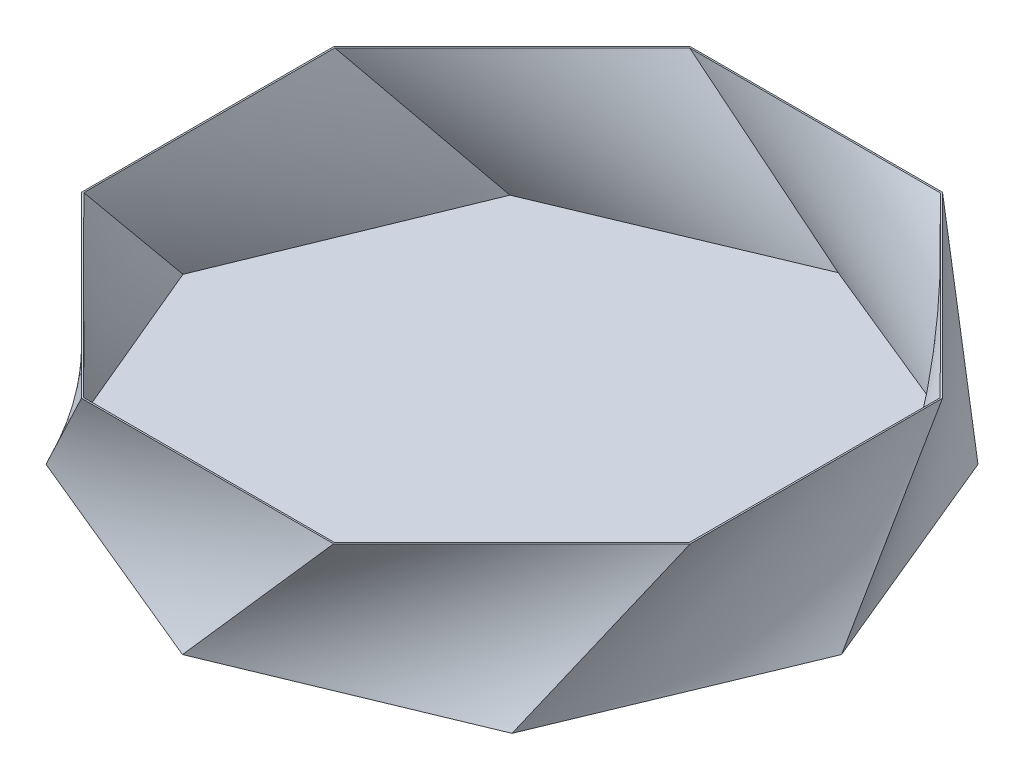
ISO-10303-21;
HEADER;
FILE_DESCRIPTION(('STEP AP214'),'2;1');
FILE_NAME('part.step','',(''),(''),'','','');
FILE_SCHEMA(('AUTOMOTIVE_DESIGN { 1 0 10303 214 1 1 1 1 }'));
ENDSEC;
DATA;
#1=APPLICATION_CONTEXT('core data for automotive mechanical design processes');
#2=APPLICATION_PROTOCOL_DEFINITION('international standard','automotive_design',2000,#1);
#3=PRODUCT_CONTEXT('',#1,'mechanical');
#4=PRODUCT('Part','Part','',(#3));
#5=PRODUCT_RELATED_PRODUCT_CATEGORY('part','',(#4));
#6=PRODUCT_DEFINITION_FORMATION('','',#4);
#7=PRODUCT_DEFINITION_CONTEXT('part definition',#1,'design');
#8=PRODUCT_DEFINITION('design','',#6,#7);
#9=PRODUCT_DEFINITION_SHAPE('','',#8);
#10=(LENGTH_UNIT() NAMED_UNIT(*) SI_UNIT(.MILLI.,.METRE.));
#11=(NAMED_UNIT(*) PLANE_ANGLE_UNIT() SI_UNIT($,.RADIAN.));
#12=(NAMED_UNIT(*) SI_UNIT($,.STERADIAN.) SOLID_ANGLE_UNIT());
#13=UNCERTAINTY_MEASURE_WITH_UNIT(LENGTH_MEASURE(1.E-05),#10,'distance_accuracy_value','');
#14=(GEOMETRIC_REPRESENTATION_CONTEXT(3) GLOBAL_UNCERTAINTY_ASSIGNED_CONTEXT((#13)) GLOBAL_UNIT_ASSIGNED_CONTEXT((#10,
#11,#12)) REPRESENTATION_CONTEXT('',''));
#15=CARTESIAN_POINT('',(0.,0.,0.));
#16=DIRECTION('',(0.,0.,1.));
#17=DIRECTION('',(1.,0.,0.));
#18=AXIS2_PLACEMENT_3D('',#15,#16,#17);
#19=CARTESIAN_POINT('',(-20.836063350552,10.1,-8.5373819747297));
#20=CARTESIAN_POINT('',(-20.787289481504,10.,-8.61037722821453));
#21=CARTESIAN_POINT('',(-15.9099025766973,0.,-15.9099025766973));
#22=CARTESIAN_POINT('',(-8.69648100049667,10.1,-20.770162376319));
#23=CARTESIAN_POINT('',(-8.61037722821452,10.,-20.787289481504));
#24=CARTESIAN_POINT('',(0.,0.,-22.5));
#25=B_SPLINE_SURFACE_WITH_KNOTS('',1,1,((#19,#20,#21),(#22,#23,#24)),.UNSPECIFIED.,.F.,.F.,.F.,
(2,2),(2,1,2),(0.,1.),(-0.01,0.,1.),.UNSPECIFIED.);
#26=DIRECTION('',(0.707106781186548,0.,-0.707106781186547));
#27=VECTOR('',#26,1.);
#28=CARTESIAN_POINT('',(-14.6988333548592,10.,-14.6988333548592));
#29=LINE('',#28,#27);
#30=CARTESIAN_POINT('',(-20.787289481504,10.,-8.61037722821452));
#31=VERTEX_POINT('',#30);
#32=CARTESIAN_POINT('',(-8.61037722821452,10.,-20.787289481504));
#33=VERTEX_POINT('',#32);
#34=EDGE_CURVE('E12',#31,#33,#29,.T.);
#35=DIRECTION('',(0.647064040189841,-0.751493254058066,-0.128709040080406));
#36=VECTOR('',#35,1.);
#37=CARTESIAN_POINT('',(-4.30518861410726,5.,-21.643644740752));
#38=LINE('',#37,#36);
#39=CARTESIAN_POINT('',(0.,0.,-22.5));
#40=VERTEX_POINT('',#39);
#41=EDGE_CURVE('E146',#33,#40,#38,.T.);
#42=DIRECTION('',(0.923879532511287,0.,-0.38268343236509));
#43=VECTOR('',#42,1.);
#44=CARTESIAN_POINT('',(-7.95495128834866,0.,-19.2049512883487));
#45=LINE('',#44,#43);
#46=CARTESIAN_POINT('',(-15.9099025766973,0.,-15.9099025766973));
#47=VERTEX_POINT('',#46);
#48=EDGE_CURVE('E585',#47,#40,#45,.T.);
#49=DIRECTION('',(0.366532335639335,-0.751493254058066,-0.548554405721067));
#50=VECTOR('',#49,1.);
#51=CARTESIAN_POINT('',(-18.3485960291006,5.,-12.2601399024559));
#52=LINE('',#51,#50);
#53=EDGE_CURVE('E541',#31,#47,#52,.T.);
#54=ORIENTED_EDGE('',*,*,#34,.T.);
#55=ORIENTED_EDGE('',*,*,#41,.T.);
#56=ORIENTED_EDGE('',*,*,#48,.F.);
#57=ORIENTED_EDGE('',*,*,#53,.F.);
#58=EDGE_LOOP('',(#54,#55,#56,#57));
#59=FACE_BOUND('',#58,.T.);
#60=ADVANCED_FACE('F137',(#59),#25,.T.);
#61=CARTESIAN_POINT('',(-8.69648100049667,10.1,-20.770162376319));
#62=CARTESIAN_POINT('',(-8.61037722821452,10.,-20.787289481504));
#63=CARTESIAN_POINT('',(0.,0.,-22.5));
#64=CARTESIAN_POINT('',(8.53738197472969,10.1,-20.836063350552));
#65=CARTESIAN_POINT('',(8.61037722821452,10.,-20.787289481504));
#66=CARTESIAN_POINT('',(15.9099025766973,0.,-15.9099025766973));
#67=B_SPLINE_SURFACE_WITH_KNOTS('',1,1,((#61,#62,#63),(#64,#65,#66)),.UNSPECIFIED.,.F.,.F.,.F.,
(2,2),(2,1,2),(0.,1.),(-0.01,0.,1.),.UNSPECIFIED.);
#68=DIRECTION('',(1.,0.,0.));
#69=VECTOR('',#68,1.);
#70=CARTESIAN_POINT('',(0.,10.,-20.787289481504));
#71=LINE('',#70,#69);
#72=CARTESIAN_POINT('',(8.61037722821452,10.,-20.787289481504));
#73=VERTEX_POINT('',#72);
#74=EDGE_CURVE('E163',#33,#73,#71,.T.);
#75=DIRECTION('',(0.548554405721067,-0.751493254058066,0.366532335639334));
#76=VECTOR('',#75,1.);
#77=CARTESIAN_POINT('',(12.2601399024559,5.,-18.3485960291006));
#78=LINE('',#77,#76);
#79=CARTESIAN_POINT('',(15.9099025766973,0.,-15.9099025766973));
#80=VERTEX_POINT('',#79);
#81=EDGE_CURVE('E547',#73,#80,#78,.T.);
#82=DIRECTION('',(0.923879532511287,0.,0.38268343236509));
#83=VECTOR('',#82,1.);
#84=CARTESIAN_POINT('',(7.95495128834866,0.,-19.2049512883487));
#85=LINE('',#84,#83);
#86=EDGE_CURVE('E545',#40,#80,#85,.T.);
#87=ORIENTED_EDGE('',*,*,#74,.T.);
#88=ORIENTED_EDGE('',*,*,#81,.T.);
#89=ORIENTED_EDGE('',*,*,#86,.F.);
#90=ORIENTED_EDGE('',*,*,#41,.F.);
#91=EDGE_LOOP('',(#87,#88,#89,#90));
#92=FACE_BOUND('',#91,.T.);
#93=ADVANCED_FACE('F309',(#92),#67,.T.);
#94=CARTESIAN_POINT('',(8.53738197472969,10.1,-20.836063350552));
#95=CARTESIAN_POINT('',(8.61037722821452,10.,-20.787289481504));
#96=CARTESIAN_POINT('',(15.9099025766973,0.,-15.9099025766973));
#97=CARTESIAN_POINT('',(20.770162376319,10.1,-8.69648100049667));
#98=CARTESIAN_POINT('',(20.787289481504,10.,-8.61037722821452));
#99=CARTESIAN_POINT('',(22.5,0.,0.));
#100=B_SPLINE_SURFACE_WITH_KNOTS('',1,1,((#94,#95,#96),(#97,#98,#99)),.UNSPECIFIED.,.F.,.F.,.F.,
(2,2),(2,1,2),(0.,1.),(-0.01,0.,1.),.UNSPECIFIED.);
#101=DIRECTION('',(0.707106781186547,0.,0.707106781186548));
#102=VECTOR('',#101,1.);
#103=CARTESIAN_POINT('',(14.6988333548592,10.,-14.6988333548592));
#104=LINE('',#103,#102);
#105=CARTESIAN_POINT('',(20.787289481504,10.,-8.61037722821452));
#106=VERTEX_POINT('',#105);
#107=EDGE_CURVE('E551',#73,#106,#104,.T.);
#108=DIRECTION('',(0.128709040080407,-0.751493254058066,0.64706404018984));
#109=VECTOR('',#108,1.);
#110=CARTESIAN_POINT('',(21.643644740752,5.,-4.30518861410726));
#111=LINE('',#110,#109);
#112=CARTESIAN_POINT('',(22.5,0.,0.));
#113=VERTEX_POINT('',#112);
#114=EDGE_CURVE('E554',#106,#113,#111,.T.);
#115=DIRECTION('',(0.38268343236509,0.,0.923879532511287));
#116=VECTOR('',#115,1.);
#117=CARTESIAN_POINT('',(19.2049512883487,0.,-7.95495128834866));
#118=LINE('',#117,#116);
#119=EDGE_CURVE('E588',#80,#113,#118,.T.);
#120=ORIENTED_EDGE('',*,*,#107,.T.);
#121=ORIENTED_EDGE('',*,*,#114,.T.);
#122=ORIENTED_EDGE('',*,*,#119,.F.);
#123=ORIENTED_EDGE('',*,*,#81,.F.);
#124=EDGE_LOOP('',(#120,#121,#122,#123));
#125=FACE_BOUND('',#124,.T.);
#126=ADVANCED_FACE('F315',(#125),#100,.T.);
#127=CARTESIAN_POINT('',(20.770162376319,10.1,-8.69648100049667));
#128=CARTESIAN_POINT('',(20.787289481504,10.,-8.61037722821452));
#129=CARTESIAN_POINT('',(22.5,0.,0.));
#130=CARTESIAN_POINT('',(20.836063350552,10.1,8.53738197472969));
#131=CARTESIAN_POINT('',(20.787289481504,10.,8.61037722821452));
#132=CARTESIAN_POINT('',(15.9099025766973,0.,15.9099025766973));
#133=B_SPLINE_SURFACE_WITH_KNOTS('',1,1,((#127,#128,#129),(#130,#131,#132)),.UNSPECIFIED.,.F.,
.F.,.F.,(2,2),(2,1,2),(0.,1.),(-0.01,0.,1.),.UNSPECIFIED.);
#134=DIRECTION('',(0.,0.,1.));
#135=VECTOR('',#134,1.);
#136=CARTESIAN_POINT('',(20.787289481504,10.,0.));
#137=LINE('',#136,#135);
#138=CARTESIAN_POINT('',(20.7872894815039,10.,8.61037722821453));
#139=VERTEX_POINT('',#138);
#140=EDGE_CURVE('E557',#106,#139,#137,.T.);
#141=DIRECTION('',(-0.366532335639334,-0.751493254058066,0.548554405721067));
#142=VECTOR('',#141,1.);
#143=CARTESIAN_POINT('',(18.3485960291006,5.,12.2601399024559));
#144=LINE('',#143,#142);
#145=CARTESIAN_POINT('',(15.9099025766973,0.,15.9099025766973));
#146=VERTEX_POINT('',#145);
#147=EDGE_CURVE('E560',#139,#146,#144,.T.);
#148=DIRECTION('',(-0.38268343236509,0.,0.923879532511287));
#149=VECTOR('',#148,1.);
#150=CARTESIAN_POINT('',(19.2049512883487,0.,7.95495128834866));
#151=LINE('',#150,#149);
#152=EDGE_CURVE('E591',#113,#146,#151,.T.);
#153=ORIENTED_EDGE('',*,*,#140,.T.);
#154=ORIENTED_EDGE('',*,*,#147,.T.);
#155=ORIENTED_EDGE('',*,*,#152,.F.);
#156=ORIENTED_EDGE('',*,*,#114,.F.);
#157=EDGE_LOOP('',(#153,#154,#155,#156));
#158=FACE_BOUND('',#157,.T.);
#159=ADVANCED_FACE('F330',(#158),#133,.T.);
#160=CARTESIAN_POINT('',(20.836063350552,10.1,8.5373819747297));
#161=CARTESIAN_POINT('',(20.7872894815039,10.,8.61037722821453));
#162=CARTESIAN_POINT('',(15.9099025766973,0.,15.9099025766973));
#163=CARTESIAN_POINT('',(8.69648100049666,10.1,20.770162376319));
#164=CARTESIAN_POINT('',(8.61037722821451,10.,20.787289481504));
#165=CARTESIAN_POINT('',(0.,0.,22.5));
#166=B_SPLINE_SURFACE_WITH_KNOTS('',1,1,((#160,#161,#162),(#163,#164,#165)),.UNSPECIFIED.,.F.,
.F.,.F.,(2,2),(2,1,2),(0.,1.),(-0.01,0.,1.),.UNSPECIFIED.);
#167=DIRECTION('',(-0.707106781186548,0.,0.707106781186547));
#168=VECTOR('',#167,1.);
#169=CARTESIAN_POINT('',(14.6988333548592,10.,14.6988333548592));
#170=LINE('',#169,#168);
#171=CARTESIAN_POINT('',(8.61037722821451,10.,20.787289481504));
#172=VERTEX_POINT('',#171);
#173=EDGE_CURVE('E563',#139,#172,#170,.T.);
#174=DIRECTION('',(-0.64706404018984,-0.751493254058066,0.128709040080406));
#175=VECTOR('',#174,1.);
#176=CARTESIAN_POINT('',(4.30518861410725,5.,21.643644740752));
#177=LINE('',#176,#175);
#178=CARTESIAN_POINT('',(0.,0.,22.5));
#179=VERTEX_POINT('',#178);
#180=EDGE_CURVE('E566',#172,#179,#177,.T.);
#181=DIRECTION('',(-0.923879532511287,0.,0.38268343236509));
#182=VECTOR('',#181,1.);
#183=CARTESIAN_POINT('',(7.95495128834866,0.,19.2049512883487));
#184=LINE('',#183,#182);
#185=EDGE_CURVE('E594',#146,#179,#184,.T.);
#186=ORIENTED_EDGE('',*,*,#173,.T.);
#187=ORIENTED_EDGE('',*,*,#180,.T.);
#188=ORIENTED_EDGE('',*,*,#185,.F.);
#189=ORIENTED_EDGE('',*,*,#147,.F.);
#190=EDGE_LOOP('',(#186,#187,#188,#189));
#191=FACE_BOUND('',#190,.T.);
#192=ADVANCED_FACE('F391',(#191),#166,.T.);
#193=CARTESIAN_POINT('',(8.69648100049666,10.1,20.770162376319));
#194=CARTESIAN_POINT('',(8.61037722821451,10.,20.787289481504));
#195=CARTESIAN_POINT('',(0.,0.,22.5));
#196=CARTESIAN_POINT('',(-8.53738197472969,10.1,20.836063350552));
#197=CARTESIAN_POINT('',(-8.61037722821452,10.,20.787289481504));
#198=CARTESIAN_POINT('',(-15.9099025766973,0.,15.9099025766973));
#199=B_SPLINE_SURFACE_WITH_KNOTS('',1,1,((#193,#194,#195),(#196,#197,#198)),.UNSPECIFIED.,.F.,
.F.,.F.,(2,2),(2,1,2),(0.,1.),(-0.01,0.,1.),.UNSPECIFIED.);
#200=DIRECTION('',(-1.,0.,0.));
#201=VECTOR('',#200,1.);
#202=CARTESIAN_POINT('',(0.,10.,20.787289481504));
#203=LINE('',#202,#201);
#204=CARTESIAN_POINT('',(-8.61037722821453,10.,20.787289481504));
#205=VERTEX_POINT('',#204);
#206=EDGE_CURVE('E569',#172,#205,#203,.T.);
#207=DIRECTION('',(-0.548554405721067,-0.751493254058066,-0.366532335639334));
#208=VECTOR('',#207,1.);
#209=CARTESIAN_POINT('',(-12.2601399024559,5.,18.3485960291006));
#210=LINE('',#209,#208);
#211=CARTESIAN_POINT('',(-15.9099025766973,0.,15.9099025766973));
#212=VERTEX_POINT('',#211);
#213=EDGE_CURVE('E572',#205,#212,#210,.T.);
#214=DIRECTION('',(-0.923879532511287,0.,-0.38268343236509));
#215=VECTOR('',#214,1.);
#216=CARTESIAN_POINT('',(-7.95495128834866,0.,19.2049512883487));
#217=LINE('',#216,#215);
#218=EDGE_CURVE('E597',#179,#212,#217,.T.);
#219=ORIENTED_EDGE('',*,*,#206,.T.);
#220=ORIENTED_EDGE('',*,*,#213,.T.);
#221=ORIENTED_EDGE('',*,*,#218,.F.);
#222=ORIENTED_EDGE('',*,*,#180,.F.);
#223=EDGE_LOOP('',(#219,#220,#221,#222));
#224=FACE_BOUND('',#223,.T.);
#225=ADVANCED_FACE('F396',(#224),#199,.T.);
#226=CARTESIAN_POINT('',(-8.5373819747297,10.1,20.836063350552));
#227=CARTESIAN_POINT('',(-8.61037722821453,10.,20.787289481504));
#228=CARTESIAN_POINT('',(-15.9099025766973,0.,15.9099025766973));
#229=CARTESIAN_POINT('',(-20.770162376319,10.1,8.69648100049666));
#230=CARTESIAN_POINT('',(-20.787289481504,10.,8.61037722821452));
#231=CARTESIAN_POINT('',(-22.5,0.,0.));
#232=B_SPLINE_SURFACE_WITH_KNOTS('',1,1,((#226,#227,#228),(#229,#230,#231)),.UNSPECIFIED.,.F.,
.F.,.F.,(2,2),(2,1,2),(0.,1.),(-0.01,0.,1.),.UNSPECIFIED.);
#233=DIRECTION('',(-0.707106781186547,0.,-0.707106781186548));
#234=VECTOR('',#233,1.);
#235=CARTESIAN_POINT('',(-14.6988333548592,10.,14.6988333548592));
#236=LINE('',#235,#234);
#237=CARTESIAN_POINT('',(-20.787289481504,10.,8.61037722821452));
#238=VERTEX_POINT('',#237);
#239=EDGE_CURVE('E575',#205,#238,#236,.T.);
#240=DIRECTION('',(-0.128709040080406,-0.751493254058066,-0.64706404018984));
#241=VECTOR('',#240,1.);
#242=CARTESIAN_POINT('',(-21.643644740752,5.,4.30518861410726));
#243=LINE('',#242,#241);
#244=CARTESIAN_POINT('',(-22.5,0.,0.));
#245=VERTEX_POINT('',#244);
#246=EDGE_CURVE('E578',#238,#245,#243,.T.);
#247=DIRECTION('',(-0.38268343236509,0.,-0.923879532511287));
#248=VECTOR('',#247,1.);
#249=CARTESIAN_POINT('',(-19.2049512883487,0.,7.95495128834866));
#250=LINE('',#249,#248);
#251=EDGE_CURVE('E599',#212,#245,#250,.T.);
#252=ORIENTED_EDGE('',*,*,#239,.T.);
#253=ORIENTED_EDGE('',*,*,#246,.T.);
#254=ORIENTED_EDGE('',*,*,#251,.F.);
#255=ORIENTED_EDGE('',*,*,#213,.F.);
#256=EDGE_LOOP('',(#252,#253,#254,#255));
#257=FACE_BOUND('',#256,.T.);
#258=ADVANCED_FACE('F408',(#257),#232,.T.);
#259=CARTESIAN_POINT('',(-20.770162376319,10.1,8.69648100049666));
#260=CARTESIAN_POINT('',(-20.787289481504,10.,8.61037722821452));
#261=CARTESIAN_POINT('',(-22.5,0.,0.));
#262=CARTESIAN_POINT('',(-20.836063350552,10.1,-8.53738197472969));
#263=CARTESIAN_POINT('',(-20.787289481504,10.,-8.61037722821452));
#264=CARTESIAN_POINT('',(-15.9099025766973,0.,-15.9099025766973));
#265=B_SPLINE_SURFACE_WITH_KNOTS('',1,1,((#259,#260,#261),(#262,#263,#264)),.UNSPECIFIED.,.F.,
.F.,.F.,(2,2),(2,1,2),(0.,1.),(-0.01,0.,1.),.UNSPECIFIED.);
#266=DIRECTION('',(0.,0.,-1.));
#267=VECTOR('',#266,1.);
#268=CARTESIAN_POINT('',(-20.787289481504,10.,0.));
#269=LINE('',#268,#267);
#270=EDGE_CURVE('E581',#238,#31,#269,.T.);
#271=DIRECTION('',(0.38268343236509,0.,-0.923879532511287));
#272=VECTOR('',#271,1.);
#273=CARTESIAN_POINT('',(-19.2049512883487,0.,-7.95495128834866));
#274=LINE('',#273,#272);
#275=EDGE_CURVE('E141',#245,#47,#274,.T.);
#276=ORIENTED_EDGE('',*,*,#270,.T.);
#277=ORIENTED_EDGE('',*,*,#53,.T.);
#278=ORIENTED_EDGE('',*,*,#275,.F.);
#279=ORIENTED_EDGE('',*,*,#246,.F.);
#280=EDGE_LOOP('',(#276,#277,#278,#279));
#281=FACE_BOUND('',#280,.T.);
#282=ADVANCED_FACE('F419',(#281),#265,.T.);
#283=CARTESIAN_POINT('',(0.,10.,0.));
#284=DIRECTION('',(0.,-1.,0.));
#285=DIRECTION('',(0.,0.,-1.));
#286=AXIS2_PLACEMENT_3D('',#283,#284,#285);
#287=PLANE('',#286);
#288=CARTESIAN_POINT('',(-8.57811338631225,10.,20.6761362461462));
#289=CARTESIAN_POINT('',(-9.28159865977057,10.,19.9735449465769));
#290=CARTESIAN_POINT('',(-9.98493509661093,10.,19.2708046202353));
#291=CARTESIAN_POINT('',(-11.3913052158472,10.,17.8650211353263));
#292=CARTESIAN_POINT('',(-12.0943388982534,10.,17.1619779767693));
#293=CARTESIAN_POINT('',(-14.1129926808437,10.,15.1424132051619));
#294=CARTESIAN_POINT('',(-15.4282273855412,10.,13.8255063582337));
#295=CARTESIAN_POINT('',(-18.0577401764891,10.,11.1907364755296));
#296=CARTESIAN_POINT('',(-19.3720182622118,10.,9.87287343922707));
#297=CARTESIAN_POINT('',(-20.6858782936354,10.,8.55459400313844));
#298=B_SPLINE_CURVE_WITH_KNOTS('',3,(#288,#289,#290,#291,#292,#293,#294,#295,#296,#297),
.UNSPECIFIED.,.F.,.F.,(4,2,2,2,4),(0.,2.98273941887619,5.96547873626734,11.549094724453,
17.1327137907881),.UNSPECIFIED.);
#299=CARTESIAN_POINT('',(-8.57811338631225,10.,20.6761362461462));
#300=VERTEX_POINT('',#299);
#301=CARTESIAN_POINT('',(-20.6858782936354,10.,8.55459400313844));
#302=VERTEX_POINT('',#301);
#303=EDGE_CURVE('E471',#300,#302,#298,.T.);
#304=ORIENTED_EDGE('',*,*,#303,.T.);
#305=CARTESIAN_POINT('',(-20.6858782936354,10.,8.55459400313844));
#306=CARTESIAN_POINT('',(-20.6865104286346,10.,7.5603477234831));
#307=CARTESIAN_POINT('',(-20.6869319424106,10.,6.56610130936827));
#308=CARTESIAN_POINT('',(-20.6873467555215,10.,4.57760842613898));
#309=CARTESIAN_POINT('',(-20.687340054871,10.,3.58336195702452));
#310=CARTESIAN_POINT('',(-20.6866958883594,10.,0.72791023343798));
#311=CARTESIAN_POINT('',(-20.6855135052489,10.,-1.13329490675941));
#312=CARTESIAN_POINT('',(-20.6817961800189,10.,-4.85570488338155));
#313=CARTESIAN_POINT('',(-20.6792612371536,10.,-6.71690971980557));
#314=CARTESIAN_POINT('',(-20.6761362461462,10.,-8.57811338631225));
#315=B_SPLINE_CURVE_WITH_KNOTS('',3,(#305,#306,#307,#308,#309,#310,#311,#312,#313,#314),
.UNSPECIFIED.,.F.,.F.,(4,2,2,2,4),(0.,2.98273941887618,5.96547873626733,11.549094724453,
17.1327137907881),.UNSPECIFIED.);
#316=CARTESIAN_POINT('',(-20.6761362461462,10.,-8.57811338631225));
#317=VERTEX_POINT('',#316);
#318=EDGE_CURVE('E466',#302,#317,#315,.T.);
#319=ORIENTED_EDGE('',*,*,#318,.T.);
#320=CARTESIAN_POINT('',(-20.6761362461462,10.,-8.57811338631225));
#321=CARTESIAN_POINT('',(-19.9735449465769,10.,-9.28159865977057));
#322=CARTESIAN_POINT('',(-19.2708046202353,10.,-9.98493509661093));
#323=CARTESIAN_POINT('',(-17.8650211353263,10.,-11.3913052158472));
#324=CARTESIAN_POINT('',(-17.1619779767693,10.,-12.0943388982534));
#325=CARTESIAN_POINT('',(-15.1424132051619,10.,-14.1129926808437));
#326=CARTESIAN_POINT('',(-13.8255063582337,10.,-15.4282273855412));
#327=CARTESIAN_POINT('',(-11.1907364755296,9.99999999999999,-18.0577401764891));
#328=CARTESIAN_POINT('',(-9.87287343922708,9.99999999999999,-19.3720182622118));
#329=CARTESIAN_POINT('',(-8.55459400313844,10.,-20.6858782936354));
#330=B_SPLINE_CURVE_WITH_KNOTS('',3,(#320,#321,#322,#323,#324,#325,#326,#327,#328,#329),
.UNSPECIFIED.,.F.,.F.,(4,2,2,2,4),(0.,2.98273941887619,5.96547873626733,11.549094724453,
17.1327137907881),.UNSPECIFIED.);
#331=CARTESIAN_POINT('',(-8.55459400313844,10.,-20.6858782936354));
#332=VERTEX_POINT('',#331);
#333=EDGE_CURVE('E280',#317,#332,#330,.T.);
#334=ORIENTED_EDGE('',*,*,#333,.T.);
#335=CARTESIAN_POINT('',(-8.55459400313844,10.,-20.6858782936354));
#336=CARTESIAN_POINT('',(-7.5603477234831,10.,-20.6865104286346));
#337=CARTESIAN_POINT('',(-6.56610130936827,10.,-20.6869319424106));
#338=CARTESIAN_POINT('',(-4.57760842613898,10.,-20.6873467555215));
#339=CARTESIAN_POINT('',(-3.58336195702452,10.,-20.687340054871));
#340=CARTESIAN_POINT('',(-0.727910233437976,10.,-20.6866958883594));
#341=CARTESIAN_POINT('',(1.13329490675941,10.,-20.6855135052489));
#342=CARTESIAN_POINT('',(4.85570488338156,10.,-20.6817961800188));
#343=CARTESIAN_POINT('',(6.71690971980558,10.,-20.6792612371536));
#344=CARTESIAN_POINT('',(8.57811338631226,10.,-20.6761362461462));
#345=B_SPLINE_CURVE_WITH_KNOTS('',3,(#335,#336,#337,#338,#339,#340,#341,#342,#343,#344),
.UNSPECIFIED.,.F.,.F.,(4,2,2,2,4),(0.,2.98273941887618,5.96547873626734,11.549094724453,
17.1327137907881),.UNSPECIFIED.);
#346=CARTESIAN_POINT('',(8.57811338631226,10.,-20.6761362461462));
#347=VERTEX_POINT('',#346);
#348=EDGE_CURVE('E274',#332,#347,#345,.T.);
#349=ORIENTED_EDGE('',*,*,#348,.T.);
#350=CARTESIAN_POINT('',(8.57811338631226,10.,-20.6761362461462));
#351=CARTESIAN_POINT('',(9.28159865977057,10.,-19.9735449465769));
#352=CARTESIAN_POINT('',(9.98493509661093,10.,-19.2708046202353));
#353=CARTESIAN_POINT('',(11.3913052158472,10.,-17.8650211353263));
#354=CARTESIAN_POINT('',(12.0943388982534,10.,-17.1619779767693));
#355=CARTESIAN_POINT('',(14.1129926808437,10.,-15.1424132051619));
#356=CARTESIAN_POINT('',(15.4282273855412,10.,-13.8255063582337));
#357=CARTESIAN_POINT('',(18.0577401764891,10.,-11.1907364755296));
#358=CARTESIAN_POINT('',(19.3720182622118,10.,-9.87287343922707));
#359=CARTESIAN_POINT('',(20.6858782936354,10.,-8.55459400313844));
#360=B_SPLINE_CURVE_WITH_KNOTS('',3,(#350,#351,#352,#353,#354,#355,#356,#357,#358,#359),
.UNSPECIFIED.,.F.,.F.,(4,2,2,2,4),(0.,2.98273941887619,5.96547873626734,11.549094724453,
17.1327137907881),.UNSPECIFIED.);
#361=CARTESIAN_POINT('',(20.6858782936354,10.,-8.55459400313844));
#362=VERTEX_POINT('',#361);
#363=EDGE_CURVE('E261',#347,#362,#360,.T.);
#364=ORIENTED_EDGE('',*,*,#363,.T.);
#365=CARTESIAN_POINT('',(20.6858782936354,10.,-8.55459400313844));
#366=CARTESIAN_POINT('',(20.6865104286346,10.,-7.5603477234831));
#367=CARTESIAN_POINT('',(20.6869319424106,10.,-6.56610130936828));
#368=CARTESIAN_POINT('',(20.6873467555215,10.,-4.57760842613899));
#369=CARTESIAN_POINT('',(20.687340054871,10.,-3.58336195702453));
#370=CARTESIAN_POINT('',(20.6866958883594,10.,-0.727910233437986));
#371=CARTESIAN_POINT('',(20.6855135052489,10.,1.1332949067594));
#372=CARTESIAN_POINT('',(20.6817961800188,9.99999999999999,4.85570488338155));
#373=CARTESIAN_POINT('',(20.6792612371536,9.99999999999999,6.71690971980558));
#374=CARTESIAN_POINT('',(20.6761362461462,10.,8.57811338631225));
#375=B_SPLINE_CURVE_WITH_KNOTS('',3,(#365,#366,#367,#368,#369,#370,#371,#372,#373,#374),
.UNSPECIFIED.,.F.,.F.,(4,2,2,2,4),(0.,2.98273941887618,5.96547873626733,11.549094724453,
17.1327137907881),.UNSPECIFIED.);
#376=CARTESIAN_POINT('',(20.6761362461462,10.,8.57811338631225));
#377=VERTEX_POINT('',#376);
#378=EDGE_CURVE('E374',#362,#377,#375,.T.);
#379=ORIENTED_EDGE('',*,*,#378,.T.);
#380=CARTESIAN_POINT('',(20.6761362461462,10.,8.57811338631225));
#381=CARTESIAN_POINT('',(19.9735449465769,10.,9.28159865977057));
#382=CARTESIAN_POINT('',(19.2708046202353,10.,9.98493509661093));
#383=CARTESIAN_POINT('',(17.8650211353263,10.,11.3913052158472));
#384=CARTESIAN_POINT('',(17.1619779767693,10.,12.0943388982534));
#385=CARTESIAN_POINT('',(15.1424132051619,9.99999999999999,14.1129926808437));
#386=CARTESIAN_POINT('',(13.8255063582337,9.99999999999999,15.4282273855412));
#387=CARTESIAN_POINT('',(11.1907364755296,10.,18.0577401764891));
#388=CARTESIAN_POINT('',(9.87287343922707,10.,19.3720182622118));
#389=CARTESIAN_POINT('',(8.55459400313843,10.,20.6858782936354));
#390=B_SPLINE_CURVE_WITH_KNOTS('',3,(#380,#381,#382,#383,#384,#385,#386,#387,#388,#389),
.UNSPECIFIED.,.F.,.F.,(4,2,2,2,4),(0.,2.98273941887619,5.96547873626734,11.549094724453,
17.1327137907881),.UNSPECIFIED.);
#391=CARTESIAN_POINT('',(8.55459400313843,10.,20.6858782936354));
#392=VERTEX_POINT('',#391);
#393=EDGE_CURVE('E375',#377,#392,#390,.T.);
#394=ORIENTED_EDGE('',*,*,#393,.T.);
#395=CARTESIAN_POINT('',(8.55459400313843,10.,20.6858782936354));
#396=CARTESIAN_POINT('',(7.5603477234831,10.,20.6865104286346));
#397=CARTESIAN_POINT('',(6.56610130936826,10.,20.6869319424106));
#398=CARTESIAN_POINT('',(4.57760842613897,10.,20.6873467555215));
#399=CARTESIAN_POINT('',(3.58336195702452,9.99999999999999,20.687340054871));
#400=CARTESIAN_POINT('',(0.727910233437975,9.99999999999999,20.6866958883594));
#401=CARTESIAN_POINT('',(-1.13329490675941,9.99999999999999,20.6855135052489));
#402=CARTESIAN_POINT('',(-4.85570488338155,10.,20.6817961800189));
#403=CARTESIAN_POINT('',(-6.71690971980558,10.,20.6792612371536));
#404=CARTESIAN_POINT('',(-8.57811338631225,10.,20.6761362461462));
#405=B_SPLINE_CURVE_WITH_KNOTS('',3,(#395,#396,#397,#398,#399,#400,#401,#402,#403,#404),
.UNSPECIFIED.,.F.,.F.,(4,2,2,2,4),(0.,2.98273941887618,5.96547873626733,11.549094724453,
17.1327137907881),.UNSPECIFIED.);
#406=EDGE_CURVE('E476',#392,#300,#405,.T.);
#407=ORIENTED_EDGE('',*,*,#406,.T.);
#408=EDGE_LOOP('',(#304,#319,#334,#349,#364,#379,#394,#407));
#409=FACE_BOUND('',#408,.T.);
#410=ORIENTED_EDGE('',*,*,#270,.F.);
#411=ORIENTED_EDGE('',*,*,#239,.F.);
#412=ORIENTED_EDGE('',*,*,#206,.F.);
#413=ORIENTED_EDGE('',*,*,#173,.F.);
#414=ORIENTED_EDGE('',*,*,#140,.F.);
#415=ORIENTED_EDGE('',*,*,#107,.F.);
#416=ORIENTED_EDGE('',*,*,#74,.F.);
#417=ORIENTED_EDGE('',*,*,#34,.F.);
#418=EDGE_LOOP('',(#410,#411,#412,#413,#414,#415,#416,#417));
#419=FACE_BOUND('',#418,.T.);
#420=ADVANCED_FACE('F278',(#409,#419),#287,.F.);
#421=CARTESIAN_POINT('',(0.,0.,0.));
#422=DIRECTION('',(0.,-1.,0.));
#423=DIRECTION('',(0.,0.,-1.));
#424=AXIS2_PLACEMENT_3D('',#421,#422,#423);
#425=PLANE('',#424);
#426=ORIENTED_EDGE('',*,*,#48,.T.);
#427=ORIENTED_EDGE('',*,*,#86,.T.);
#428=ORIENTED_EDGE('',*,*,#119,.T.);
#429=ORIENTED_EDGE('',*,*,#152,.T.);
#430=ORIENTED_EDGE('',*,*,#185,.T.);
#431=ORIENTED_EDGE('',*,*,#218,.T.);
#432=ORIENTED_EDGE('',*,*,#251,.T.);
#433=ORIENTED_EDGE('',*,*,#275,.T.);
#434=EDGE_LOOP('',(#426,#427,#428,#429,#430,#431,#432,#433));
#435=FACE_BOUND('',#434,.T.);
#436=ADVANCED_FACE('F139',(#435),#425,.T.);
#437=CARTESIAN_POINT('',(-20.836063350552,10.1,-8.5373819747297));
#438=CARTESIAN_POINT('',(-15.9099025766973,0.,-15.9099025766973));
#439=CARTESIAN_POINT('',(-8.69648100049667,10.1,-20.770162376319));
#440=CARTESIAN_POINT('',(0.,0.,-22.5));
#441=B_SPLINE_SURFACE_WITH_KNOTS('',1,1,((#437,#438),(#439,#440)),.UNSPECIFIED.,.F.,.F.,.F.,(2,
2),(2,2),(0.,1.),(-0.01,1.),.UNSPECIFIED.);
#442=OFFSET_SURFACE('',#441,-0.1,.F.);
#443=ORIENTED_EDGE('',*,*,#333,.F.);
#444=CARTESIAN_POINT('',(-20.6761362461462,10.,-8.57811338631225));
#445=CARTESIAN_POINT('',(-20.2758509018479,9.175180781875,-9.17503955299421));
#446=CARTESIAN_POINT('',(-19.8758670124085,8.35022893582645,-9.77198460300276));
#447=CARTESIAN_POINT('',(-19.0764742378158,6.70019142162381,-10.9660740964748));
#448=CARTESIAN_POINT('',(-18.6770653524826,5.87510575351171,-11.5632185398757));
#449=CARTESIAN_POINT('',(-17.8787939528879,4.22493052587999,-12.7578695346185));
#450=CARTESIAN_POINT('',(-17.47993143928,3.3998409663569,-13.3553760863923));
#451=CARTESIAN_POINT('',(-16.6826166282893,1.7497907374672,-14.5508413115576));
#452=CARTESIAN_POINT('',(-16.284164331035,0.924830068141032,-15.1487999850905));
#453=CARTESIAN_POINT('',(-15.8858489501649,0.100000000000002,-15.7470298958517));
#454=B_SPLINE_CURVE_WITH_KNOTS('',3,(#444,#445,#446,#447,#448,#449,#450,#451,#452,#453),
.UNSPECIFIED.,.F.,.F.,(4,2,2,2,4),(0.,3.2820547319676,6.56410843614091,9.8461660635872,
13.1282247188302),.UNSPECIFIED.);
#455=CARTESIAN_POINT('',(-15.8858489501649,0.0999999999999993,-15.7470298958517));
#456=VERTEX_POINT('',#455);
#457=EDGE_CURVE('E470',#317,#456,#454,.T.);
#458=ORIENTED_EDGE('',*,*,#457,.T.);
#459=CARTESIAN_POINT('',(-15.8858489501649,0.0999999999999993,-15.7470298958517));
#460=CARTESIAN_POINT('',(-14.9693886949062,0.0999999999999997,-16.1325510104813));
#461=CARTESIAN_POINT('',(-14.0528665853044,0.0999999999999999,-16.517925084544));
#462=CARTESIAN_POINT('',(-12.2196834510201,0.1,-17.2883427487631));
#463=CARTESIAN_POINT('',(-11.3030224263339,0.1,-17.6733863389109));
#464=CARTESIAN_POINT('',(-8.67216365975736,0.0999999999999997,-18.7778595872434));
#465=CARTESIAN_POINT('',(-6.95777362017652,0.0999999999999991,-19.4968313153014));
#466=CARTESIAN_POINT('',(-4.38574657342195,0.0999999999999995,-20.5742351399045));
#467=CARTESIAN_POINT('',(-3.5283302856192,0.0999999999999999,-20.9331942348383));
#468=CARTESIAN_POINT('',(-1.81335300078741,0.1,-21.6507666420825));
#469=CARTESIAN_POINT('',(-0.955792003754343,0.1,-22.0093799543832));
#470=CARTESIAN_POINT('',(-0.0981598946627701,0.0999999999999991,-22.3678231404708));
#471=B_SPLINE_CURVE_WITH_KNOTS('',3,(#459,#460,#461,#462,#463,#464,#465,#466,#467,#468,#469,
#470),.UNSPECIFIED.,.F.,.F.,(4,2,2,2,2,4),(0.,2.98273921725911,5.96547851124705,
11.5426170564867,14.331188112991,17.1197592472919),.UNSPECIFIED.);
#472=CARTESIAN_POINT('',(-0.0981598946627679,0.0999999999999996,-22.3678231404708));
#473=VERTEX_POINT('',#472);
#474=EDGE_CURVE('E506',#456,#473,#471,.T.);
#475=ORIENTED_EDGE('',*,*,#474,.T.);
#476=CARTESIAN_POINT('',(-8.55459400313844,10.,-20.6858782936354));
#477=CARTESIAN_POINT('',(-7.84945898144704,9.175180781875,-20.824924352601));
#478=CARTESIAN_POINT('',(-7.14452376800222,8.35022893582645,-20.9641969248698));
#479=CARTESIAN_POINT('',(-5.73491893807859,6.7001914216238,-21.2432896513015));
#480=CARTESIAN_POINT('',(-5.03024932151666,5.8751057535117,-21.3831098052929));
#481=CARTESIAN_POINT('',(-3.62104038210206,4.22493052587999,-21.663392504946));
#482=CARTESIAN_POINT('',(-2.91650105940616,3.3998409663569,-21.8038550513755));
#483=CARTESIAN_POINT('',(-1.50739278242708,1.7497907374672,-22.0853899091706));
#484=CARTESIAN_POINT('',(-0.802823828134699,0.924830068141032,-22.2264622207271));
#485=CARTESIAN_POINT('',(-0.0981598946627639,0.100000000000001,-22.3678231404708));
#486=B_SPLINE_CURVE_WITH_KNOTS('',3,(#476,#477,#478,#479,#480,#481,#482,#483,#484,#485),
.UNSPECIFIED.,.F.,.F.,(4,2,2,2,4),(0.,3.2820547319676,6.56410843614091,9.8461660635872,
13.1282247188302),.UNSPECIFIED.);
#487=EDGE_CURVE('E154',#332,#473,#486,.T.);
#488=ORIENTED_EDGE('',*,*,#487,.F.);
#489=EDGE_LOOP('',(#443,#458,#475,#488));
#490=FACE_BOUND('',#489,.T.);
#491=ADVANCED_FACE('F301',(#490),#442,.F.);
#492=CARTESIAN_POINT('',(-8.69648100049667,10.1,-20.770162376319));
#493=CARTESIAN_POINT('',(0.,0.,-22.5));
#494=CARTESIAN_POINT('',(8.53738197472969,10.1,-20.836063350552));
#495=CARTESIAN_POINT('',(15.9099025766973,0.,-15.9099025766973));
#496=B_SPLINE_SURFACE_WITH_KNOTS('',1,1,((#492,#493),(#494,#495)),.UNSPECIFIED.,.F.,.F.,.F.,(2,
2),(2,2),(0.,1.),(-0.01,1.),.UNSPECIFIED.);
#497=OFFSET_SURFACE('',#496,-0.1,.F.);
#498=ORIENTED_EDGE('',*,*,#348,.F.);
#499=ORIENTED_EDGE('',*,*,#487,.T.);
#500=CARTESIAN_POINT('',(-0.0981598946627679,0.0999999999999996,-22.3678231404708));
#501=CARTESIAN_POINT('',(0.822479960963865,0.0999999999999997,-21.9923924737346));
#502=CARTESIAN_POINT('',(1.74305958083392,0.0999999999999999,-21.616814095991));
#503=CARTESIAN_POINT('',(3.58408336095834,0.1,-20.865325425297));
#504=CARTESIAN_POINT('',(4.50452752120924,0.1,-20.4894151323379));
#505=CARTESIAN_POINT('',(7.14580611893469,0.0999999999999998,-19.4100975816826));
#506=CARTESIAN_POINT('',(8.86645272591217,0.099999999999999,-18.7062305434875));
#507=CARTESIAN_POINT('',(11.4469900425207,0.0999999999999995,-17.6493723277853));
#508=CARTESIAN_POINT('',(12.3070973241221,0.0999999999999999,-17.2969098665765));
#509=CARTESIAN_POINT('',(14.0271697069623,0.1,-16.5916381140458));
#510=CARTESIAN_POINT('',(14.8871348081971,0.1,-16.2388288227142));
#511=CARTESIAN_POINT('',(15.7470298958517,0.0999999999999989,-15.8858489501649));
#512=B_SPLINE_CURVE_WITH_KNOTS('',3,(#500,#501,#502,#503,#504,#505,#506,#507,#508,#509,#510,
#511),.UNSPECIFIED.,.F.,.F.,(4,2,2,2,2,4),(0.,2.98273921725912,5.96547851124706,
11.5426170564867,14.331188112991,17.1197592472919),.UNSPECIFIED.);
#513=CARTESIAN_POINT('',(15.7470298958517,0.0999999999999996,-15.8858489501649));
#514=VERTEX_POINT('',#513);
#515=EDGE_CURVE('E218',#473,#514,#512,.T.);
#516=ORIENTED_EDGE('',*,*,#515,.T.);
#517=CARTESIAN_POINT('',(8.57811338631226,10.,-20.6761362461462));
#518=CARTESIAN_POINT('',(9.17503955299421,9.17518078187501,-20.2758509018479));
#519=CARTESIAN_POINT('',(9.77198460300277,8.35022893582645,-19.8758670124084));
#520=CARTESIAN_POINT('',(10.9660740964748,6.70019142162381,-19.0764742378158));
#521=CARTESIAN_POINT('',(11.5632185398757,5.87510575351171,-18.6770653524826));
#522=CARTESIAN_POINT('',(12.7578695346185,4.22493052587999,-17.8787939528879));
#523=CARTESIAN_POINT('',(13.3553760863923,3.3998409663569,-17.47993143928));
#524=CARTESIAN_POINT('',(14.5508413115576,1.7497907374672,-16.6826166282893));
#525=CARTESIAN_POINT('',(15.1487999850905,0.924830068141028,-16.284164331035));
#526=CARTESIAN_POINT('',(15.7470298958517,0.0999999999999984,-15.8858489501649));
#527=B_SPLINE_CURVE_WITH_KNOTS('',3,(#517,#518,#519,#520,#521,#522,#523,#524,#525,#526),
.UNSPECIFIED.,.F.,.F.,(4,2,2,2,4),(0.,3.2820547319676,6.56410843614091,9.8461660635872,
13.1282247188302),.UNSPECIFIED.);
#528=EDGE_CURVE('E265',#347,#514,#527,.T.);
#529=ORIENTED_EDGE('',*,*,#528,.F.);
#530=EDGE_LOOP('',(#498,#499,#516,#529));
#531=FACE_BOUND('',#530,.T.);
#532=ADVANCED_FACE('F273',(#531),#497,.F.);
#533=CARTESIAN_POINT('',(8.53738197472969,10.1,-20.836063350552));
#534=CARTESIAN_POINT('',(15.9099025766973,0.,-15.9099025766973));
#535=CARTESIAN_POINT('',(20.770162376319,10.1,-8.69648100049667));
#536=CARTESIAN_POINT('',(22.5,0.,0.));
#537=B_SPLINE_SURFACE_WITH_KNOTS('',1,1,((#533,#534),(#535,#536)),.UNSPECIFIED.,.F.,.F.,.F.,(2,
2),(2,2),(0.,1.),(-0.01,1.),.UNSPECIFIED.);
#538=OFFSET_SURFACE('',#537,-0.1,.F.);
#539=ORIENTED_EDGE('',*,*,#363,.F.);
#540=ORIENTED_EDGE('',*,*,#528,.T.);
#541=CARTESIAN_POINT('',(15.7470298958517,0.0999999999999996,-15.8858489501649));
#542=CARTESIAN_POINT('',(16.1325510104813,0.0999999999999998,-14.9693886949062));
#543=CARTESIAN_POINT('',(16.517925084544,0.1,-14.0528665853044));
#544=CARTESIAN_POINT('',(17.2883427487631,0.1,-12.2196834510201));
#545=CARTESIAN_POINT('',(17.6733863389109,0.1,-11.3030224263339));
#546=CARTESIAN_POINT('',(18.7778595872434,0.0999999999999996,-8.67216365975736));
#547=CARTESIAN_POINT('',(19.4968313153014,0.099999999999999,-6.95777362017652));
#548=CARTESIAN_POINT('',(20.5742351399045,0.0999999999999995,-4.38574657342195));
#549=CARTESIAN_POINT('',(20.9331942348383,0.0999999999999999,-3.5283302856192));
#550=CARTESIAN_POINT('',(21.6507666420825,0.1,-1.81335300078741));
#551=CARTESIAN_POINT('',(22.0093799543832,0.1,-0.955792003754343));
#552=CARTESIAN_POINT('',(22.3678231404708,0.099999999999999,-0.0981598946627675));
#553=B_SPLINE_CURVE_WITH_KNOTS('',3,(#541,#542,#543,#544,#545,#546,#547,#548,#549,#550,#551,
#552),.UNSPECIFIED.,.F.,.F.,(4,2,2,2,2,4),(0.,2.98273921725911,5.96547851124706,
11.5426170564867,14.331188112991,17.1197592472919),.UNSPECIFIED.);
#554=CARTESIAN_POINT('',(22.3678231404708,0.0999999999999995,-0.0981598946627691));
#555=VERTEX_POINT('',#554);
#556=EDGE_CURVE('E362',#514,#555,#553,.T.);
#557=ORIENTED_EDGE('',*,*,#556,.T.);
#558=CARTESIAN_POINT('',(20.6858782936354,10.,-8.55459400313844));
#559=CARTESIAN_POINT('',(20.824924352601,9.175180781875,-7.84945898144704));
#560=CARTESIAN_POINT('',(20.9641969248698,8.35022893582644,-7.14452376800223));
#561=CARTESIAN_POINT('',(21.2432896513015,6.7001914216238,-5.73491893807859));
#562=CARTESIAN_POINT('',(21.3831098052929,5.87510575351171,-5.03024932151666));
#563=CARTESIAN_POINT('',(21.663392504946,4.22493052587999,-3.62104038210206));
#564=CARTESIAN_POINT('',(21.8038550513755,3.3998409663569,-2.91650105940616));
#565=CARTESIAN_POINT('',(22.0853899091706,1.7497907374672,-1.50739278242709));
#566=CARTESIAN_POINT('',(22.2264622207271,0.92483006814103,-0.802823828134706));
#567=CARTESIAN_POINT('',(22.3678231404708,0.100000000000001,-0.0981598946627684));
#568=B_SPLINE_CURVE_WITH_KNOTS('',3,(#558,#559,#560,#561,#562,#563,#564,#565,#566,#567),
.UNSPECIFIED.,.F.,.F.,(4,2,2,2,4),(0.,3.28205473196761,6.56410843614091,9.8461660635872,
13.1282247188302),.UNSPECIFIED.);
#569=EDGE_CURVE('E267',#362,#555,#568,.T.);
#570=ORIENTED_EDGE('',*,*,#569,.F.);
#571=EDGE_LOOP('',(#539,#540,#557,#570));
#572=FACE_BOUND('',#571,.T.);
#573=ADVANCED_FACE('F263',(#572),#538,.F.);
#574=CARTESIAN_POINT('',(20.770162376319,10.1,-8.69648100049667));
#575=CARTESIAN_POINT('',(22.5,0.,0.));
#576=CARTESIAN_POINT('',(20.836063350552,10.1,8.53738197472969));
#577=CARTESIAN_POINT('',(15.9099025766973,0.,15.9099025766973));
#578=B_SPLINE_SURFACE_WITH_KNOTS('',1,1,((#574,#575),(#576,#577)),.UNSPECIFIED.,.F.,.F.,.F.,(2,
2),(2,2),(0.,1.),(-0.01,1.),.UNSPECIFIED.);
#579=OFFSET_SURFACE('',#578,-0.1,.F.);
#580=ORIENTED_EDGE('',*,*,#378,.F.);
#581=ORIENTED_EDGE('',*,*,#569,.T.);
#582=CARTESIAN_POINT('',(22.3678231404708,0.0999999999999995,-0.0981598946627691));
#583=CARTESIAN_POINT('',(21.9923924737346,0.0999999999999998,0.822479960963862));
#584=CARTESIAN_POINT('',(21.616814095991,0.1,1.74305958083391));
#585=CARTESIAN_POINT('',(20.865325425297,0.1,3.58408336095834));
#586=CARTESIAN_POINT('',(20.4894151323379,0.1,4.50452752120923));
#587=CARTESIAN_POINT('',(19.4100975816826,0.0999999999999995,7.14580611893468));
#588=CARTESIAN_POINT('',(18.7062305434875,0.0999999999999989,8.86645272591216));
#589=CARTESIAN_POINT('',(17.6493723277853,0.0999999999999994,11.4469900425207));
#590=CARTESIAN_POINT('',(17.2969098665765,0.0999999999999999,12.3070973241221));
#591=CARTESIAN_POINT('',(16.5916381140458,0.1,14.0271697069623));
#592=CARTESIAN_POINT('',(16.2388288227142,0.1,14.8871348081971));
#593=CARTESIAN_POINT('',(15.8858489501649,0.099999999999999,15.7470298958517));
#594=B_SPLINE_CURVE_WITH_KNOTS('',3,(#582,#583,#584,#585,#586,#587,#588,#589,#590,#591,#592,
#593),.UNSPECIFIED.,.F.,.F.,(4,2,2,2,2,4),(0.,2.98273921725911,5.96547851124705,
11.5426170564867,14.331188112991,17.1197592472919),.UNSPECIFIED.);
#595=CARTESIAN_POINT('',(15.8858489501649,0.0999999999999996,15.7470298958517));
#596=VERTEX_POINT('',#595);
#597=EDGE_CURVE('E367',#555,#596,#594,.T.);
#598=ORIENTED_EDGE('',*,*,#597,.T.);
#599=CARTESIAN_POINT('',(20.6761362461462,10.,8.57811338631225));
#600=CARTESIAN_POINT('',(20.2758509018479,9.17518078187501,9.17503955299421));
#601=CARTESIAN_POINT('',(19.8758670124084,8.35022893582645,9.77198460300277));
#602=CARTESIAN_POINT('',(19.0764742378158,6.70019142162381,10.9660740964748));
#603=CARTESIAN_POINT('',(18.6770653524826,5.87510575351171,11.5632185398757));
#604=CARTESIAN_POINT('',(17.8787939528879,4.22493052587999,12.7578695346185));
#605=CARTESIAN_POINT('',(17.47993143928,3.3998409663569,13.3553760863923));
#606=CARTESIAN_POINT('',(16.6826166282893,1.7497907374672,14.5508413115576));
#607=CARTESIAN_POINT('',(16.2841643310349,0.924830068141036,15.1487999850906));
#608=CARTESIAN_POINT('',(15.8858489501649,0.0999999999999984,15.7470298958517));
#609=B_SPLINE_CURVE_WITH_KNOTS('',3,(#599,#600,#601,#602,#603,#604,#605,#606,#607,#608),
.UNSPECIFIED.,.F.,.F.,(4,2,2,2,4),(0.,3.28205473196761,6.56410843614091,9.8461660635872,
13.1282247188302),.UNSPECIFIED.);
#610=EDGE_CURVE('E368',#377,#596,#609,.T.);
#611=ORIENTED_EDGE('',*,*,#610,.F.);
#612=EDGE_LOOP('',(#580,#581,#598,#611));
#613=FACE_BOUND('',#612,.T.);
#614=ADVANCED_FACE('F344',(#613),#579,.F.);
#615=CARTESIAN_POINT('',(20.836063350552,10.1,8.5373819747297));
#616=CARTESIAN_POINT('',(15.9099025766973,0.,15.9099025766973));
#617=CARTESIAN_POINT('',(8.69648100049666,10.1,20.770162376319));
#618=CARTESIAN_POINT('',(0.,0.,22.5));
#619=B_SPLINE_SURFACE_WITH_KNOTS('',1,1,((#615,#616),(#617,#618)),.UNSPECIFIED.,.F.,.F.,.F.,(2,
2),(2,2),(0.,1.),(-0.01,1.),.UNSPECIFIED.);
#620=OFFSET_SURFACE('',#619,-0.1,.F.);
#621=ORIENTED_EDGE('',*,*,#393,.F.);
#622=ORIENTED_EDGE('',*,*,#610,.T.);
#623=CARTESIAN_POINT('',(15.8858489501649,0.0999999999999996,15.7470298958517));
#624=CARTESIAN_POINT('',(14.9693886949062,0.0999999999999997,16.1325510104813));
#625=CARTESIAN_POINT('',(14.0528665853044,0.0999999999999999,16.517925084544));
#626=CARTESIAN_POINT('',(12.21968345102,0.1,17.2883427487631));
#627=CARTESIAN_POINT('',(11.3030224263339,0.1,17.6733863389109));
#628=CARTESIAN_POINT('',(8.67216365975736,0.0999999999999998,18.7778595872434));
#629=CARTESIAN_POINT('',(6.95777362017652,0.0999999999999991,19.4968313153014));
#630=CARTESIAN_POINT('',(4.38574657342195,0.0999999999999995,20.5742351399045));
#631=CARTESIAN_POINT('',(3.5283302856192,0.0999999999999999,20.9331942348383));
#632=CARTESIAN_POINT('',(1.81335300078741,0.1,21.6507666420825));
#633=CARTESIAN_POINT('',(0.955792003754346,0.1,22.0093799543832));
#634=CARTESIAN_POINT('',(0.0981598946627743,0.099999999999999,22.3678231404708));
#635=B_SPLINE_CURVE_WITH_KNOTS('',3,(#623,#624,#625,#626,#627,#628,#629,#630,#631,#632,#633,
#634),.UNSPECIFIED.,.F.,.F.,(4,2,2,2,2,4),(0.,2.98273921725912,5.96547851124706,
11.5426170564867,14.331188112991,17.1197592472919),.UNSPECIFIED.);
#636=CARTESIAN_POINT('',(0.0981598946627747,0.0999999999999996,22.3678231404708));
#637=VERTEX_POINT('',#636);
#638=EDGE_CURVE('E495',#596,#637,#635,.T.);
#639=ORIENTED_EDGE('',*,*,#638,.T.);
#640=CARTESIAN_POINT('',(8.55459400313843,10.,20.6858782936354));
#641=CARTESIAN_POINT('',(7.84945898144703,9.17518078187501,20.824924352601));
#642=CARTESIAN_POINT('',(7.14452376800222,8.35022893582645,20.9641969248698));
#643=CARTESIAN_POINT('',(5.73491893807858,6.7001914216238,21.2432896513015));
#644=CARTESIAN_POINT('',(5.03024932151665,5.8751057535117,21.3831098052929));
#645=CARTESIAN_POINT('',(3.62104038210206,4.22493052587999,21.663392504946));
#646=CARTESIAN_POINT('',(2.91650105940616,3.3998409663569,21.8038550513755));
#647=CARTESIAN_POINT('',(1.50739278242708,1.7497907374672,22.0853899091706));
#648=CARTESIAN_POINT('',(0.802823828134701,0.924830068141035,22.2264622207271));
#649=CARTESIAN_POINT('',(0.0981598946627666,0.100000000000003,22.3678231404708));
#650=B_SPLINE_CURVE_WITH_KNOTS('',3,(#640,#641,#642,#643,#644,#645,#646,#647,#648,#649),
.UNSPECIFIED.,.F.,.F.,(4,2,2,2,4),(0.,3.2820547319676,6.56410843614091,9.84616606358719,
13.1282247188302),.UNSPECIFIED.);
#651=EDGE_CURVE('E482',#392,#637,#650,.T.);
#652=ORIENTED_EDGE('',*,*,#651,.F.);
#653=EDGE_LOOP('',(#621,#622,#639,#652));
#654=FACE_BOUND('',#653,.T.);
#655=ADVANCED_FACE('F380',(#654),#620,.F.);
#656=CARTESIAN_POINT('',(8.69648100049666,10.1,20.770162376319));
#657=CARTESIAN_POINT('',(0.,0.,22.5));
#658=CARTESIAN_POINT('',(-8.53738197472969,10.1,20.836063350552));
#659=CARTESIAN_POINT('',(-15.9099025766973,0.,15.9099025766973));
#660=B_SPLINE_SURFACE_WITH_KNOTS('',1,1,((#656,#657),(#658,#659)),.UNSPECIFIED.,.F.,.F.,.F.,(2,
2),(2,2),(0.,1.),(-0.01,1.),.UNSPECIFIED.);
#661=OFFSET_SURFACE('',#660,-0.1,.F.);
#662=ORIENTED_EDGE('',*,*,#406,.F.);
#663=ORIENTED_EDGE('',*,*,#651,.T.);
#664=CARTESIAN_POINT('',(0.0981598946627747,0.0999999999999996,22.3678231404708));
#665=CARTESIAN_POINT('',(-0.822479960963857,0.0999999999999998,21.9923924737346));
#666=CARTESIAN_POINT('',(-1.74305958083391,0.0999999999999999,21.616814095991));
#667=CARTESIAN_POINT('',(-3.58408336095833,0.1,20.865325425297));
#668=CARTESIAN_POINT('',(-4.50452752120922,0.1,20.4894151323379));
#669=CARTESIAN_POINT('',(-7.14580611893468,0.0999999999999997,19.4100975816826));
#670=CARTESIAN_POINT('',(-8.86645272591216,0.0999999999999991,18.7062305434875));
#671=CARTESIAN_POINT('',(-11.4469900425207,0.0999999999999995,17.6493723277853));
#672=CARTESIAN_POINT('',(-12.3070973241221,0.0999999999999999,17.2969098665765));
#673=CARTESIAN_POINT('',(-14.0271697069623,0.1,16.5916381140458));
#674=CARTESIAN_POINT('',(-14.8871348081971,0.1,16.2388288227142));
#675=CARTESIAN_POINT('',(-15.7470298958517,0.0999999999999991,15.8858489501649));
#676=B_SPLINE_CURVE_WITH_KNOTS('',3,(#664,#665,#666,#667,#668,#669,#670,#671,#672,#673,#674,
#675),.UNSPECIFIED.,.F.,.F.,(4,2,2,2,2,4),(0.,2.98273921725911,5.96547851124705,
11.5426170564867,14.331188112991,17.1197592472919),.UNSPECIFIED.);
#677=CARTESIAN_POINT('',(-15.7470298958517,0.0999999999999997,15.8858489501649));
#678=VERTEX_POINT('',#677);
#679=EDGE_CURVE('E456',#637,#678,#676,.T.);
#680=ORIENTED_EDGE('',*,*,#679,.T.);
#681=CARTESIAN_POINT('',(-8.57811338631225,10.,20.6761362461462));
#682=CARTESIAN_POINT('',(-9.17503955299421,9.17518078187501,20.2758509018479));
#683=CARTESIAN_POINT('',(-9.77198460300276,8.35022893582645,19.8758670124084));
#684=CARTESIAN_POINT('',(-10.9660740964748,6.70019142162381,19.0764742378158));
#685=CARTESIAN_POINT('',(-11.5632185398757,5.87510575351171,18.6770653524826));
#686=CARTESIAN_POINT('',(-12.7578695346185,4.22493052587999,17.8787939528879));
#687=CARTESIAN_POINT('',(-13.3553760863923,3.3998409663569,17.47993143928));
#688=CARTESIAN_POINT('',(-14.5508413115576,1.7497907374672,16.6826166282893));
#689=CARTESIAN_POINT('',(-15.1487999850905,0.924830068141035,16.2841643310349));
#690=CARTESIAN_POINT('',(-15.7470298958517,0.0999999999999984,15.8858489501649));
#691=B_SPLINE_CURVE_WITH_KNOTS('',3,(#681,#682,#683,#684,#685,#686,#687,#688,#689,#690),
.UNSPECIFIED.,.F.,.F.,(4,2,2,2,4),(0.,3.28205473196761,6.56410843614091,9.8461660635872,
13.1282247188302),.UNSPECIFIED.);
#692=EDGE_CURVE('E436',#300,#678,#691,.T.);
#693=ORIENTED_EDGE('',*,*,#692,.F.);
#694=EDGE_LOOP('',(#662,#663,#680,#693));
#695=FACE_BOUND('',#694,.T.);
#696=ADVANCED_FACE('F384',(#695),#661,.F.);
#697=CARTESIAN_POINT('',(-8.5373819747297,10.1,20.836063350552));
#698=CARTESIAN_POINT('',(-15.9099025766973,0.,15.9099025766973));
#699=CARTESIAN_POINT('',(-20.770162376319,10.1,8.69648100049666));
#700=CARTESIAN_POINT('',(-22.5,0.,0.));
#701=B_SPLINE_SURFACE_WITH_KNOTS('',1,1,((#697,#698),(#699,#700)),.UNSPECIFIED.,.F.,.F.,.F.,(2,
2),(2,2),(0.,1.),(-0.01,1.),.UNSPECIFIED.);
#702=OFFSET_SURFACE('',#701,-0.1,.F.);
#703=ORIENTED_EDGE('',*,*,#303,.F.);
#704=ORIENTED_EDGE('',*,*,#692,.T.);
#705=CARTESIAN_POINT('',(-15.7470298958517,0.0999999999999997,15.8858489501649));
#706=CARTESIAN_POINT('',(-16.1325510104813,0.0999999999999997,14.9693886949061));
#707=CARTESIAN_POINT('',(-16.517925084544,0.0999999999999999,14.0528665853044));
#708=CARTESIAN_POINT('',(-17.2883427487631,0.1,12.21968345102));
#709=CARTESIAN_POINT('',(-17.6733863389109,0.1,11.3030224263339));
#710=CARTESIAN_POINT('',(-18.7778595872434,0.1,8.67216365975735));
#711=CARTESIAN_POINT('',(-19.4968313153014,0.0999999999999993,6.95777362017652));
#712=CARTESIAN_POINT('',(-20.5742351399045,0.0999999999999996,4.38574657342195));
#713=CARTESIAN_POINT('',(-20.9331942348383,0.0999999999999999,3.5283302856192));
#714=CARTESIAN_POINT('',(-21.6507666420825,0.1,1.81335300078742));
#715=CARTESIAN_POINT('',(-22.0093799543832,0.0999999999999999,0.955792003754352));
#716=CARTESIAN_POINT('',(-22.3678231404708,0.0999999999999991,0.0981598946627772));
#717=B_SPLINE_CURVE_WITH_KNOTS('',3,(#705,#706,#707,#708,#709,#710,#711,#712,#713,#714,#715,
#716),.UNSPECIFIED.,.F.,.F.,(4,2,2,2,2,4),(0.,2.98273921725911,5.96547851124706,
11.5426170564867,14.331188112991,17.1197592472919),.UNSPECIFIED.);
#718=CARTESIAN_POINT('',(-22.3678231404708,0.0999999999999996,0.0981598946627778));
#719=VERTEX_POINT('',#718);
#720=EDGE_CURVE('E450',#678,#719,#717,.T.);
#721=ORIENTED_EDGE('',*,*,#720,.T.);
#722=CARTESIAN_POINT('',(-20.6858782936354,10.,8.55459400313844));
#723=CARTESIAN_POINT('',(-20.824924352601,9.175180781875,7.84945898144704));
#724=CARTESIAN_POINT('',(-20.9641969248698,8.35022893582645,7.14452376800223));
#725=CARTESIAN_POINT('',(-21.2432896513015,6.70019142162381,5.73491893807859));
#726=CARTESIAN_POINT('',(-21.3831098052929,5.87510575351171,5.03024932151666));
#727=CARTESIAN_POINT('',(-21.663392504946,4.22493052588,3.62104038210207));
#728=CARTESIAN_POINT('',(-21.8038550513755,3.3998409663569,2.91650105940616));
#729=CARTESIAN_POINT('',(-22.0853899091706,1.7497907374672,1.50739278242709));
#730=CARTESIAN_POINT('',(-22.2264622207271,0.924830068141035,0.802823828134712));
#731=CARTESIAN_POINT('',(-22.3678231404708,0.100000000000003,0.0981598946627765));
#732=B_SPLINE_CURVE_WITH_KNOTS('',3,(#722,#723,#724,#725,#726,#727,#728,#729,#730,#731),
.UNSPECIFIED.,.F.,.F.,(4,2,2,2,4),(0.,3.2820547319676,6.56410843614091,9.84616606358719,
13.1282247188302),.UNSPECIFIED.);
#733=EDGE_CURVE('E445',#302,#719,#732,.T.);
#734=ORIENTED_EDGE('',*,*,#733,.F.);
#735=EDGE_LOOP('',(#703,#704,#721,#734));
#736=FACE_BOUND('',#735,.T.);
#737=ADVANCED_FACE('F429',(#736),#702,.F.);
#738=CARTESIAN_POINT('',(-20.770162376319,10.1,8.69648100049666));
#739=CARTESIAN_POINT('',(-22.5,0.,0.));
#740=CARTESIAN_POINT('',(-20.836063350552,10.1,-8.53738197472969));
#741=CARTESIAN_POINT('',(-15.9099025766973,0.,-15.9099025766973));
#742=B_SPLINE_SURFACE_WITH_KNOTS('',1,1,((#738,#739),(#740,#741)),.UNSPECIFIED.,.F.,.F.,.F.,(2,
2),(2,2),(0.,1.),(-0.01,1.),.UNSPECIFIED.);
#743=OFFSET_SURFACE('',#742,-0.1,.F.);
#744=ORIENTED_EDGE('',*,*,#318,.F.);
#745=ORIENTED_EDGE('',*,*,#733,.T.);
#746=CARTESIAN_POINT('',(-22.3678231404708,0.0999999999999996,0.0981598946627778));
#747=CARTESIAN_POINT('',(-21.9923924737346,0.0999999999999998,-0.822479960963855));
#748=CARTESIAN_POINT('',(-21.616814095991,0.0999999999999999,-1.7430595808339));
#749=CARTESIAN_POINT('',(-20.865325425297,0.1,-3.58408336095833));
#750=CARTESIAN_POINT('',(-20.4894151323379,0.1,-4.50452752120922));
#751=CARTESIAN_POINT('',(-19.4100975816826,0.1,-7.14580611893468));
#752=CARTESIAN_POINT('',(-18.7062305434875,0.0999999999999994,-8.86645272591216));
#753=CARTESIAN_POINT('',(-17.6493723277853,0.0999999999999996,-11.4469900425207));
#754=CARTESIAN_POINT('',(-17.2969098665765,0.0999999999999999,-12.3070973241221));
#755=CARTESIAN_POINT('',(-16.5916381140458,0.1,-14.0271697069623));
#756=CARTESIAN_POINT('',(-16.2388288227142,0.1,-14.8871348081971));
#757=CARTESIAN_POINT('',(-15.8858489501649,0.0999999999999993,-15.7470298958517));
#758=B_SPLINE_CURVE_WITH_KNOTS('',3,(#746,#747,#748,#749,#750,#751,#752,#753,#754,#755,#756,
#757),.UNSPECIFIED.,.F.,.F.,(4,2,2,2,2,4),(0.,2.98273921725911,5.96547851124706,
11.5426170564867,14.331188112991,17.1197592472919),.UNSPECIFIED.);
#759=EDGE_CURVE('E457',#719,#456,#758,.T.);
#760=ORIENTED_EDGE('',*,*,#759,.T.);
#761=ORIENTED_EDGE('',*,*,#457,.F.);
#762=EDGE_LOOP('',(#744,#745,#760,#761));
#763=FACE_BOUND('',#762,.T.);
#764=ADVANCED_FACE('F345',(#763),#743,.F.);
#765=CARTESIAN_POINT('',(0.,0.1,0.));
#766=DIRECTION('',(0.,-1.,0.));
#767=DIRECTION('',(0.,0.,-1.));
#768=AXIS2_PLACEMENT_3D('',#765,#766,#767);
#769=PLANE('',#768);
#770=ORIENTED_EDGE('',*,*,#474,.F.);
#771=ORIENTED_EDGE('',*,*,#759,.F.);
#772=ORIENTED_EDGE('',*,*,#720,.F.);
#773=ORIENTED_EDGE('',*,*,#679,.F.);
#774=ORIENTED_EDGE('',*,*,#638,.F.);
#775=ORIENTED_EDGE('',*,*,#597,.F.);
#776=ORIENTED_EDGE('',*,*,#556,.F.);
#777=ORIENTED_EDGE('',*,*,#515,.F.);
#778=EDGE_LOOP('',(#770,#771,#772,#773,#774,#775,#776,#777));
#779=FACE_BOUND('',#778,.T.);
#780=ADVANCED_FACE('F304',(#779),#769,.F.);
#781=CLOSED_SHELL('',(#60,#93,#126,#159,#192,#225,#258,#282,#420,#436,#491,#532,#573,#614,#655,
#696,#737,#764,#780));
#782=MANIFOLD_SOLID_BREP('B2',#781);
#783=ADVANCED_BREP_SHAPE_REPRESENTATION('',(#18,#782),#14);
#784=SHAPE_DEFINITION_REPRESENTATION(#9,#783);
ENDSEC;
END-ISO-10303-21;
